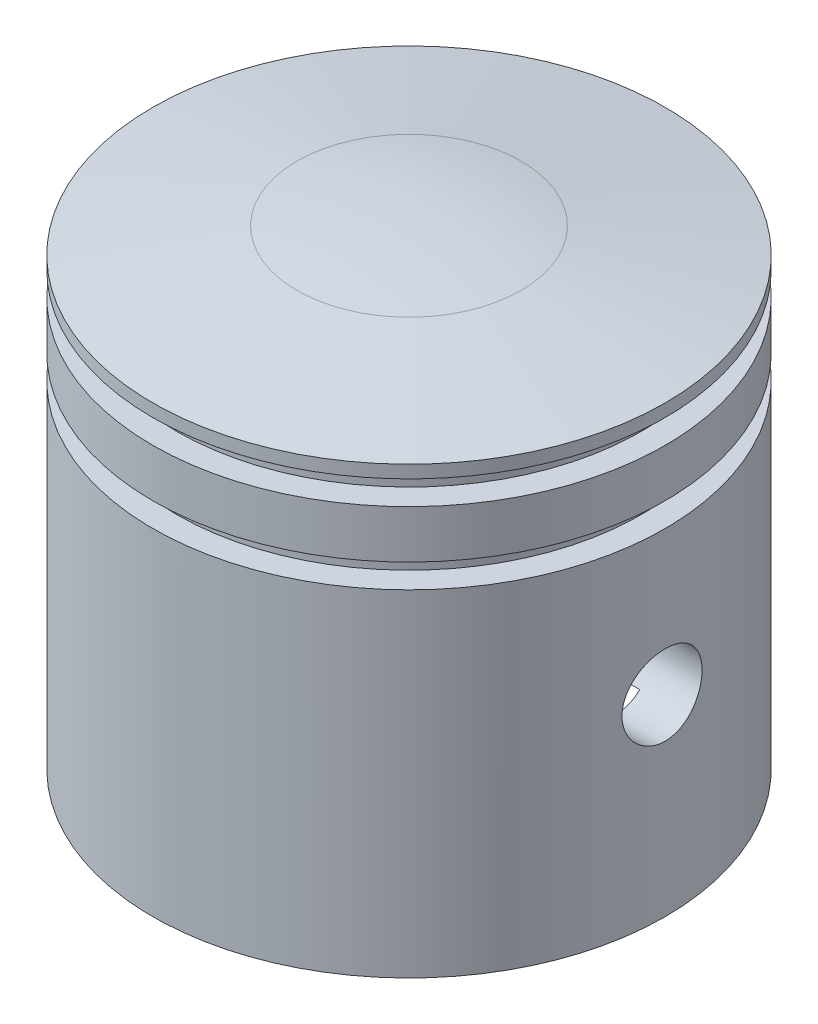
ISO-10303-21;
HEADER;
FILE_DESCRIPTION(('STEP AP214'),'2;1');
FILE_NAME('part.step','',(''),(''),'','','');
FILE_SCHEMA(('AUTOMOTIVE_DESIGN { 1 0 10303 214 1 1 1 1 }'));
ENDSEC;
DATA;
#1=APPLICATION_CONTEXT('core data for automotive mechanical design processes');
#2=APPLICATION_PROTOCOL_DEFINITION('international standard','automotive_design',2000,#1);
#3=PRODUCT_CONTEXT('',#1,'mechanical');
#4=PRODUCT('Part','Part','',(#3));
#5=PRODUCT_RELATED_PRODUCT_CATEGORY('part','',(#4));
#6=PRODUCT_DEFINITION_FORMATION('','',#4);
#7=PRODUCT_DEFINITION_CONTEXT('part definition',#1,'design');
#8=PRODUCT_DEFINITION('design','',#6,#7);
#9=PRODUCT_DEFINITION_SHAPE('','',#8);
#10=(LENGTH_UNIT() NAMED_UNIT(*) SI_UNIT(.MILLI.,.METRE.));
#11=(NAMED_UNIT(*) PLANE_ANGLE_UNIT() SI_UNIT($,.RADIAN.));
#12=(NAMED_UNIT(*) SI_UNIT($,.STERADIAN.) SOLID_ANGLE_UNIT());
#13=UNCERTAINTY_MEASURE_WITH_UNIT(LENGTH_MEASURE(1.E-05),#10,'distance_accuracy_value','');
#14=(GEOMETRIC_REPRESENTATION_CONTEXT(3) GLOBAL_UNCERTAINTY_ASSIGNED_CONTEXT((#13)) GLOBAL_UNIT_ASSIGNED_CONTEXT((#10,
#11,#12)) REPRESENTATION_CONTEXT('',''));
#15=CARTESIAN_POINT('',(0.,0.,0.));
#16=DIRECTION('',(0.,0.,1.));
#17=DIRECTION('',(1.,0.,0.));
#18=AXIS2_PLACEMENT_3D('',#15,#16,#17);
#19=CARTESIAN_POINT('',(0.,10.,0.));
#20=DIRECTION('',(0.,-1.,0.));
#21=DIRECTION('',(1.,0.,0.));
#22=AXIS2_PLACEMENT_3D('',#19,#20,#21);
#23=PLANE('',#22);
#24=DIRECTION('',(1.,0.,0.));
#25=VECTOR('',#24,1.);
#26=CARTESIAN_POINT('',(-16.,10.,-1.5));
#27=LINE('',#26,#25);
#28=CARTESIAN_POINT('',(-12.913171570145,10.,-1.5));
#29=VERTEX_POINT('',#28);
#30=CARTESIAN_POINT('',(-9.88685996664259,10.,-1.5));
#31=VERTEX_POINT('',#30);
#32=EDGE_CURVE('E65',#29,#31,#27,.T.);
#33=ORIENTED_EDGE('',*,*,#32,.F.);
#34=CARTESIAN_POINT('',(0.,10.,0.));
#35=DIRECTION('',(0.,-1.,0.));
#36=DIRECTION('',(1.,0.,0.));
#37=AXIS2_PLACEMENT_3D('',#34,#35,#36);
#38=CIRCLE('',#37,13.);
#39=CARTESIAN_POINT('',(12.913171570145,10.,-1.5));
#40=VERTEX_POINT('',#39);
#41=EDGE_CURVE('E102',#29,#40,#38,.T.);
#42=ORIENTED_EDGE('',*,*,#41,.T.);
#43=CARTESIAN_POINT('',(9.88685996664259,10.,-1.5));
#44=VERTEX_POINT('',#43);
#45=EDGE_CURVE('E248',#44,#40,#27,.T.);
#46=ORIENTED_EDGE('',*,*,#45,.F.);
#47=CARTESIAN_POINT('',(0.,10.,0.));
#48=DIRECTION('',(0.,-1.,0.));
#49=DIRECTION('',(1.,0.,0.));
#50=AXIS2_PLACEMENT_3D('',#47,#48,#49);
#51=CIRCLE('',#50,10.);
#52=EDGE_CURVE('E99',#44,#31,#51,.F.);
#53=ORIENTED_EDGE('',*,*,#52,.T.);
#54=EDGE_LOOP('',(#33,#42,#46,#53));
#55=FACE_BOUND('',#54,.T.);
#56=ADVANCED_FACE('F37',(#55),#23,.T.);
#57=CARTESIAN_POINT('',(0.,-10.,0.));
#58=DIRECTION('',(0.,1.,0.));
#59=DIRECTION('',(1.,0.,0.));
#60=AXIS2_PLACEMENT_3D('',#57,#58,#59);
#61=SPHERICAL_SURFACE('',#60,40.);
#62=CARTESIAN_POINT('',(0.,29.3827373350304,0.));
#63=DIRECTION('',(0.,1.,0.));
#64=DIRECTION('',(-1.,0.,0.));
#65=AXIS2_PLACEMENT_3D('',#62,#63,#64);
#66=CIRCLE('',#65,7.);
#67=CARTESIAN_POINT('',(-7.,29.3827373350304,0.));
#68=VERTEX_POINT('',#67);
#69=EDGE_CURVE('E89',#68,#68,#66,.T.);
#70=ORIENTED_EDGE('',*,*,#69,.T.);
#71=EDGE_LOOP('',(#70));
#72=FACE_BOUND('',#71,.T.);
#73=ADVANCED_FACE('F39',(#72),#61,.T.);
#74=CARTESIAN_POINT('',(0.,27.7957945086542,0.));
#75=DIRECTION('',(0.,-1.,0.));
#76=DIRECTION('',(1.,0.,0.));
#77=AXIS2_PLACEMENT_3D('',#74,#75,#76);
#78=CONICAL_SURFACE('',#77,16.,1.39626340159546);
#79=ORIENTED_EDGE('',*,*,#69,.F.);
#80=EDGE_LOOP('',(#79));
#81=FACE_BOUND('',#80,.T.);
#82=CARTESIAN_POINT('',(0.,27.7957945086542,0.));
#83=DIRECTION('',(0.,1.,0.));
#84=DIRECTION('',(-1.,0.,0.));
#85=AXIS2_PLACEMENT_3D('',#82,#83,#84);
#86=CIRCLE('',#85,16.);
#87=CARTESIAN_POINT('',(-16.,27.7957945086542,0.));
#88=VERTEX_POINT('',#87);
#89=EDGE_CURVE('E224',#88,#88,#86,.T.);
#90=ORIENTED_EDGE('',*,*,#89,.T.);
#91=EDGE_LOOP('',(#90));
#92=FACE_BOUND('',#91,.T.);
#93=ADVANCED_FACE('F154',(#81,#92),#78,.T.);
#94=CARTESIAN_POINT('',(0.,30.,0.));
#95=DIRECTION('',(0.,1.,0.));
#96=DIRECTION('',(-1.,0.,0.));
#97=AXIS2_PLACEMENT_3D('',#94,#95,#96);
#98=CYLINDRICAL_SURFACE('',#97,16.);
#99=CARTESIAN_POINT('',(0.,27.,0.));
#100=DIRECTION('',(0.,1.,0.));
#101=DIRECTION('',(0.,0.,1.));
#102=AXIS2_PLACEMENT_3D('',#99,#100,#101);
#103=CIRCLE('',#102,16.);
#104=CARTESIAN_POINT('',(0.,27.,16.));
#105=VERTEX_POINT('',#104);
#106=EDGE_CURVE('E213',#105,#105,#103,.T.);
#107=ORIENTED_EDGE('',*,*,#106,.T.);
#108=EDGE_LOOP('',(#107));
#109=FACE_BOUND('',#108,.T.);
#110=ORIENTED_EDGE('',*,*,#89,.F.);
#111=EDGE_LOOP('',(#110));
#112=FACE_BOUND('',#111,.T.);
#113=ADVANCED_FACE('F149',(#109,#112),#98,.T.);
#114=CARTESIAN_POINT('',(18.0909758481835,25.5,0.));
#115=DIRECTION('',(0.,-1.,0.));
#116=DIRECTION('',(0.,0.,-1.));
#117=AXIS2_PLACEMENT_3D('',#114,#115,#116);
#118=PLANE('',#117);
#119=CARTESIAN_POINT('',(0.,25.5,0.));
#120=DIRECTION('',(0.,-1.,0.));
#121=DIRECTION('',(0.,0.,-1.));
#122=AXIS2_PLACEMENT_3D('',#119,#120,#121);
#123=CIRCLE('',#122,14.5);
#124=CARTESIAN_POINT('',(0.,25.5,-14.5));
#125=VERTEX_POINT('',#124);
#126=EDGE_CURVE('E210',#125,#125,#123,.T.);
#127=ORIENTED_EDGE('',*,*,#126,.T.);
#128=EDGE_LOOP('',(#127));
#129=FACE_BOUND('',#128,.T.);
#130=CARTESIAN_POINT('',(0.,25.5,0.));
#131=DIRECTION('',(0.,-1.,0.));
#132=DIRECTION('',(0.,0.,-1.));
#133=AXIS2_PLACEMENT_3D('',#130,#131,#132);
#134=CIRCLE('',#133,16.);
#135=CARTESIAN_POINT('',(0.,25.5,-16.));
#136=VERTEX_POINT('',#135);
#137=EDGE_CURVE('E105',#136,#136,#134,.T.);
#138=ORIENTED_EDGE('',*,*,#137,.F.);
#139=EDGE_LOOP('',(#138));
#140=FACE_BOUND('',#139,.T.);
#141=ADVANCED_FACE('F153',(#129,#140),#118,.F.);
#142=CARTESIAN_POINT('',(18.0909758481835,27.,0.));
#143=DIRECTION('',(0.,1.,0.));
#144=DIRECTION('',(0.,0.,1.));
#145=AXIS2_PLACEMENT_3D('',#142,#143,#144);
#146=PLANE('',#145);
#147=CARTESIAN_POINT('',(0.,27.,0.));
#148=DIRECTION('',(0.,-1.,0.));
#149=DIRECTION('',(0.,0.,-1.));
#150=AXIS2_PLACEMENT_3D('',#147,#148,#149);
#151=CIRCLE('',#150,14.5);
#152=CARTESIAN_POINT('',(0.,27.,-14.5));
#153=VERTEX_POINT('',#152);
#154=EDGE_CURVE('E216',#153,#153,#151,.T.);
#155=ORIENTED_EDGE('',*,*,#154,.F.);
#156=EDGE_LOOP('',(#155));
#157=FACE_BOUND('',#156,.T.);
#158=ORIENTED_EDGE('',*,*,#106,.F.);
#159=EDGE_LOOP('',(#158));
#160=FACE_BOUND('',#159,.T.);
#161=ADVANCED_FACE('F199',(#157,#160),#146,.F.);
#162=CARTESIAN_POINT('',(0.,0.,0.));
#163=DIRECTION('',(0.,-1.,0.));
#164=DIRECTION('',(0.,0.,-1.));
#165=AXIS2_PLACEMENT_3D('',#162,#163,#164);
#166=CYLINDRICAL_SURFACE('',#165,14.5);
#167=ORIENTED_EDGE('',*,*,#126,.F.);
#168=EDGE_LOOP('',(#167));
#169=FACE_BOUND('',#168,.T.);
#170=ORIENTED_EDGE('',*,*,#154,.T.);
#171=EDGE_LOOP('',(#170));
#172=FACE_BOUND('',#171,.T.);
#173=ADVANCED_FACE('F191',(#169,#172),#166,.T.);
#174=ORIENTED_EDGE('',*,*,#137,.T.);
#175=EDGE_LOOP('',(#174));
#176=FACE_BOUND('',#175,.T.);
#177=CARTESIAN_POINT('',(0.,22.5,0.));
#178=DIRECTION('',(0.,1.,0.));
#179=DIRECTION('',(0.,0.,1.));
#180=AXIS2_PLACEMENT_3D('',#177,#178,#179);
#181=CIRCLE('',#180,16.);
#182=CARTESIAN_POINT('',(0.,22.5,16.));
#183=VERTEX_POINT('',#182);
#184=EDGE_CURVE('E207',#183,#183,#181,.T.);
#185=ORIENTED_EDGE('',*,*,#184,.T.);
#186=EDGE_LOOP('',(#185));
#187=FACE_BOUND('',#186,.T.);
#188=ADVANCED_FACE('F156',(#176,#187),#98,.T.);
#189=CARTESIAN_POINT('',(17.2340348869537,21.,0.));
#190=DIRECTION('',(0.,-1.,0.));
#191=DIRECTION('',(0.,0.,-1.));
#192=AXIS2_PLACEMENT_3D('',#189,#190,#191);
#193=PLANE('',#192);
#194=CARTESIAN_POINT('',(0.,21.,0.));
#195=DIRECTION('',(0.,-1.,0.));
#196=DIRECTION('',(0.,0.,-1.));
#197=AXIS2_PLACEMENT_3D('',#194,#195,#196);
#198=CIRCLE('',#197,14.5);
#199=CARTESIAN_POINT('',(0.,21.,-14.5));
#200=VERTEX_POINT('',#199);
#201=EDGE_CURVE('E230',#200,#200,#198,.T.);
#202=ORIENTED_EDGE('',*,*,#201,.T.);
#203=EDGE_LOOP('',(#202));
#204=FACE_BOUND('',#203,.T.);
#205=CARTESIAN_POINT('',(0.,21.,0.));
#206=DIRECTION('',(0.,-1.,0.));
#207=DIRECTION('',(0.,0.,-1.));
#208=AXIS2_PLACEMENT_3D('',#205,#206,#207);
#209=CIRCLE('',#208,16.);
#210=CARTESIAN_POINT('',(0.,21.,-16.));
#211=VERTEX_POINT('',#210);
#212=EDGE_CURVE('E209',#211,#211,#209,.T.);
#213=ORIENTED_EDGE('',*,*,#212,.F.);
#214=EDGE_LOOP('',(#213));
#215=FACE_BOUND('',#214,.T.);
#216=ADVANCED_FACE('F190',(#204,#215),#193,.F.);
#217=CARTESIAN_POINT('',(17.2340348869537,22.5,0.));
#218=DIRECTION('',(0.,1.,0.));
#219=DIRECTION('',(0.,0.,1.));
#220=AXIS2_PLACEMENT_3D('',#217,#218,#219);
#221=PLANE('',#220);
#222=CARTESIAN_POINT('',(0.,22.5,0.));
#223=DIRECTION('',(0.,-1.,0.));
#224=DIRECTION('',(0.,0.,-1.));
#225=AXIS2_PLACEMENT_3D('',#222,#223,#224);
#226=CIRCLE('',#225,14.5);
#227=CARTESIAN_POINT('',(0.,22.5,-14.5));
#228=VERTEX_POINT('',#227);
#229=EDGE_CURVE('E233',#228,#228,#226,.T.);
#230=ORIENTED_EDGE('',*,*,#229,.F.);
#231=EDGE_LOOP('',(#230));
#232=FACE_BOUND('',#231,.T.);
#233=ORIENTED_EDGE('',*,*,#184,.F.);
#234=EDGE_LOOP('',(#233));
#235=FACE_BOUND('',#234,.T.);
#236=ADVANCED_FACE('F197',(#232,#235),#221,.F.);
#237=CARTESIAN_POINT('',(0.,0.,0.));
#238=DIRECTION('',(0.,-1.,0.));
#239=DIRECTION('',(0.,0.,-1.));
#240=AXIS2_PLACEMENT_3D('',#237,#238,#239);
#241=CYLINDRICAL_SURFACE('',#240,14.5);
#242=ORIENTED_EDGE('',*,*,#201,.F.);
#243=EDGE_LOOP('',(#242));
#244=FACE_BOUND('',#243,.T.);
#245=ORIENTED_EDGE('',*,*,#229,.T.);
#246=EDGE_LOOP('',(#245));
#247=FACE_BOUND('',#246,.T.);
#248=ADVANCED_FACE('F185',(#244,#247),#241,.T.);
#249=CARTESIAN_POINT('',(0.,0.,0.));
#250=DIRECTION('',(0.,1.,0.));
#251=DIRECTION('',(-1.,0.,0.));
#252=AXIS2_PLACEMENT_3D('',#249,#250,#251);
#253=PLANE('',#252);
#254=CARTESIAN_POINT('',(0.,0.,0.));
#255=DIRECTION('',(0.,-1.,0.));
#256=DIRECTION('',(1.,0.,0.));
#257=AXIS2_PLACEMENT_3D('',#254,#255,#256);
#258=CIRCLE('',#257,13.);
#259=CARTESIAN_POINT('',(13.,0.,0.));
#260=VERTEX_POINT('',#259);
#261=EDGE_CURVE('E240',#260,#260,#258,.T.);
#262=ORIENTED_EDGE('',*,*,#261,.F.);
#263=EDGE_LOOP('',(#262));
#264=FACE_BOUND('',#263,.T.);
#265=CARTESIAN_POINT('',(0.,0.,0.));
#266=DIRECTION('',(0.,1.,0.));
#267=DIRECTION('',(-1.,0.,0.));
#268=AXIS2_PLACEMENT_3D('',#265,#266,#267);
#269=CIRCLE('',#268,16.);
#270=CARTESIAN_POINT('',(-16.,0.,0.));
#271=VERTEX_POINT('',#270);
#272=EDGE_CURVE('E222',#271,#271,#269,.T.);
#273=ORIENTED_EDGE('',*,*,#272,.F.);
#274=EDGE_LOOP('',(#273));
#275=FACE_BOUND('',#274,.T.);
#276=ADVANCED_FACE('F158',(#264,#275),#253,.F.);
#277=CARTESIAN_POINT('',(-16.,9.5,0.));
#278=CARTESIAN_POINT('',(-15.9999977019448,9.50000569827152,-0.139515097271033));
#279=CARTESIAN_POINT('',(-15.9981561248574,9.51171811377356,-0.279109404865704));
#280=CARTESIAN_POINT('',(-15.9909869809759,9.55824369127675,-0.554391314978102));
#281=CARTESIAN_POINT('',(-15.9856560884472,9.59307889250351,-0.690075061323317));
#282=CARTESIAN_POINT('',(-15.9721069716578,9.68477966280662,-0.953512538047404));
#283=CARTESIAN_POINT('',(-15.9638909956317,9.7416280813616,-1.0812723522899));
#284=CARTESIAN_POINT('',(-15.9454779403815,9.87569854514161,-1.3254212510446));
#285=CARTESIAN_POINT('',(-15.9352811186255,9.95291794303594,-1.44181181036831));
#286=CARTESIAN_POINT('',(-15.9139426841436,10.126233048354,-1.66091991165162));
#287=CARTESIAN_POINT('',(-15.9027945139234,10.2224669948902,-1.76352747914264));
#288=CARTESIAN_POINT('',(-15.8808607613029,10.4307819482689,-1.95120768822823));
#289=CARTESIAN_POINT('',(-15.8700752005075,10.5428638973002,-2.03627928654192));
#290=CARTESIAN_POINT('',(-15.8500242812744,10.7804382713437,-2.18690544328884));
#291=CARTESIAN_POINT('',(-15.840767397861,10.9059994823618,-2.25235273557992));
#292=CARTESIAN_POINT('',(-15.8249120174236,11.1665014108578,-2.36118681597065));
#293=CARTESIAN_POINT('',(-15.8183133630222,11.3014415725106,-2.40457491010063));
#294=CARTESIAN_POINT('',(-15.8085863451104,11.5757109011438,-2.46771559322167));
#295=CARTESIAN_POINT('',(-15.8054302653236,11.7149955858188,-2.48765705487496));
#296=CARTESIAN_POINT('',(-15.8028617107177,11.9949671888926,-2.50392369757622));
#297=CARTESIAN_POINT('',(-15.8034490028802,12.135654019466,-2.50025034860466));
#298=CARTESIAN_POINT('',(-15.8082755045521,12.4130970318527,-2.4695458080889));
#299=CARTESIAN_POINT('',(-15.8124817218495,12.5498772233531,-2.44272562959693));
#300=CARTESIAN_POINT('',(-15.8240205634547,12.8169720063593,-2.36681937833752));
#301=CARTESIAN_POINT('',(-15.8313532830641,12.9472864006405,-2.31773262684132));
#302=CARTESIAN_POINT('',(-15.8483550685462,13.1983887126772,-2.19846916949384));
#303=CARTESIAN_POINT('',(-15.8580339308724,13.3191337917731,-2.12820372315549));
#304=CARTESIAN_POINT('',(-15.878630461501,13.5471995356855,-1.96864058146637));
#305=CARTESIAN_POINT('',(-15.8895482178821,13.6545192448875,-1.87934153253017));
#306=CARTESIAN_POINT('',(-15.911537862489,13.8539102466333,-1.68309088822333));
#307=CARTESIAN_POINT('',(-15.9226101363559,13.9458031582695,-1.57595800560539));
#308=CARTESIAN_POINT('',(-15.9435512534783,14.1103331456399,-1.34769694737936));
#309=CARTESIAN_POINT('',(-15.9534200906202,14.1829701235568,-1.22656870068132));
#310=CARTESIAN_POINT('',(-15.9708539902704,14.3069380734224,-0.973595927056491));
#311=CARTESIAN_POINT('',(-15.9784174854193,14.358254558533,-0.841744186240459));
#312=CARTESIAN_POINT('',(-15.9903756000068,14.4379659674472,-0.571149534696758));
#313=CARTESIAN_POINT('',(-15.9947704520898,14.4663625740665,-0.4324071306872));
#314=CARTESIAN_POINT('',(-15.9998651172728,14.4991892764502,-0.153508336763735));
#315=CARTESIAN_POINT('',(-16.0006027179286,14.5038644789762,-0.0133814615087019));
#316=CARTESIAN_POINT('',(-15.9984028649127,14.489767294664,0.265654546411642));
#317=CARTESIAN_POINT('',(-15.9954655349964,14.4709956974109,0.404563719925156));
#318=CARTESIAN_POINT('',(-15.9862692369322,14.4107416123198,0.676473446265705));
#319=CARTESIAN_POINT('',(-15.9800278421539,14.3693792417323,0.809501262056041));
#320=CARTESIAN_POINT('',(-15.9649207568356,14.2652449056012,1.06673406785663));
#321=CARTESIAN_POINT('',(-15.9560549341007,14.2024718615573,1.19093861303941));
#322=CARTESIAN_POINT('',(-15.9365897274094,14.0567280088734,1.42807220225041));
#323=CARTESIAN_POINT('',(-15.9259772866342,13.9736025799095,1.54090512378372));
#324=CARTESIAN_POINT('',(-15.9042388046444,13.7897279140922,1.75110696507806));
#325=CARTESIAN_POINT('',(-15.8931127309268,13.6889775607952,1.84847490447018));
#326=CARTESIAN_POINT('',(-15.8714802753665,13.4716188027828,2.02588080776691));
#327=CARTESIAN_POINT('',(-15.860980411908,13.3548751528777,2.10575398584126));
#328=CARTESIAN_POINT('',(-15.8419069280583,13.1094839263387,2.2447556772664));
#329=CARTESIAN_POINT('',(-15.83333325222,12.9808366925105,2.30388478778105));
#330=CARTESIAN_POINT('',(-15.8191307135236,12.7157703592858,2.39946771944995));
#331=CARTESIAN_POINT('',(-15.8134908234896,12.5793825312344,2.43600654947912));
#332=CARTESIAN_POINT('',(-15.8057657028079,12.302310856336,2.48564122040535));
#333=CARTESIAN_POINT('',(-15.8036802038444,12.161627334581,2.49873883084997));
#334=CARTESIAN_POINT('',(-15.8033105804488,11.8816012840925,2.50107452690756));
#335=CARTESIAN_POINT('',(-15.804985160429,11.7422609030665,2.49057180548425));
#336=CARTESIAN_POINT('',(-15.8118569894183,11.4673547028557,2.44656223255901));
#337=CARTESIAN_POINT('',(-15.8170542307995,11.3317888754983,2.41305543086961));
#338=CARTESIAN_POINT('',(-15.830370888549,11.0683621733595,2.32408329891852));
#339=CARTESIAN_POINT('',(-15.8384876895341,10.9404945217416,2.26863761738581));
#340=CARTESIAN_POINT('',(-15.856731840474,10.6958343863237,2.13738768546417));
#341=CARTESIAN_POINT('',(-15.8668592701083,10.5790423417116,2.06158262820886));
#342=CARTESIAN_POINT('',(-15.8881156809226,10.3585344558732,1.8908300813908));
#343=CARTESIAN_POINT('',(-15.8992540116029,10.2549678033862,1.79569107094768));
#344=CARTESIAN_POINT('',(-15.9212004364073,10.0651787636133,1.58937594638204));
#345=CARTESIAN_POINT('',(-15.9320084534012,9.97896040140812,1.47819612078432));
#346=CARTESIAN_POINT('',(-15.952151024567,9.82584877696844,1.24216685884341));
#347=CARTESIAN_POINT('',(-15.9614763443027,9.75907462724039,1.11723937214238));
#348=CARTESIAN_POINT('',(-15.9775125983888,9.64755900380705,0.857851882357784));
#349=CARTESIAN_POINT('',(-15.9842262014212,9.60279502744161,0.723401776581762));
#350=CARTESIAN_POINT('',(-15.9927744586488,9.54656697890941,0.490314239911593));
#351=CARTESIAN_POINT('',(-15.9954699162612,9.529131509371,0.393105575651624));
#352=CARTESIAN_POINT('',(-15.9990834869762,9.50584608662092,0.197277797850582));
#353=CARTESIAN_POINT('',(-16.0000016250796,9.49999597044266,0.0986587041691184));
#354=CARTESIAN_POINT('',(-16.,9.5,0.));
#355=B_SPLINE_CURVE_WITH_KNOTS('',3,(#277,#278,#279,#280,#281,#282,#283,#284,#285,#286,#287,
#288,#289,#290,#291,#292,#293,#294,#295,#296,#297,#298,#299,#300,#301,#302,#303,#304,#305,#306,
#307,#308,#309,#310,#311,#312,#313,#314,#315,#316,#317,#318,#319,#320,#321,#322,#323,#324,#325,
#326,#327,#328,#329,#330,#331,#332,#333,#334,#335,#336,#337,#338,#339,#340,#341,#342,#343,#344,
#345,#346,#347,#348,#349,#350,#351,#352,#353,#354),.UNSPECIFIED.,.T.,.F.,(4,2,2,2,2,2,2,2,2,2,2,
2,2,2,2,2,2,2,2,2,2,2,2,2,2,2,2,2,2,2,2,2,2,2,2,2,2,2,4),(0.,0.418184740477491,
0.836768642528014,1.25502707944103,1.6732311879203,2.09459568152199,2.51598523645422,
2.93963778605759,3.36326525009238,3.78345631134994,4.20362121670545,4.6199957602258,
5.0363829965105,5.45453977402347,5.87272629892069,6.29545732334367,6.71819049513827,
7.14121043754565,7.56419931829866,7.98280854005914,8.40140366528356,8.81779444756567,
9.23420620742031,9.65388541469671,10.0735912160142,10.4970948024959,10.9205861964898,
11.3424741039513,11.764330162293,12.1815758159869,12.598820566189,13.0156924696662,
13.4325808967135,13.8538201231554,14.275156971423,14.6990230419984,15.1224548565628,
15.4181801635154,15.7139013105871),.UNSPECIFIED.);
#356=CARTESIAN_POINT('',(-16.,9.5,0.));
#357=VERTEX_POINT('',#356);
#358=EDGE_CURVE('E145',#357,#357,#355,.T.);
#359=ORIENTED_EDGE('',*,*,#358,.T.);
#360=EDGE_LOOP('',(#359));
#361=FACE_BOUND('',#360,.T.);
#362=CARTESIAN_POINT('',(15.8034806292791,12.,-2.5));
#363=CARTESIAN_POINT('',(15.8034830346332,11.860496621659,-2.49999429179104));
#364=CARTESIAN_POINT('',(15.8053478026579,11.7209140023147,-2.48828377742084));
#365=CARTESIAN_POINT('',(15.8125997089632,11.4456563709971,-2.44176643645043));
#366=CARTESIAN_POINT('',(15.8179902148259,11.3099852245206,-2.40693752801736));
#367=CARTESIAN_POINT('',(15.8316684916183,11.0465744103556,-2.31525516047132));
#368=CARTESIAN_POINT('',(15.8399539668268,10.9188285521292,-2.25841914921922));
#369=CARTESIAN_POINT('',(15.8584858981599,10.6747031091579,-2.12437791816389));
#370=CARTESIAN_POINT('',(15.8687321022282,10.5583220663405,-2.04717531605122));
#371=CARTESIAN_POINT('',(15.8901303851737,10.3392035148487,-1.87387730110911));
#372=CARTESIAN_POINT('',(15.9012888784461,10.2365789256004,-1.777639886175));
#373=CARTESIAN_POINT('',(15.9231973082665,10.0488657795701,-1.56931080987672));
#374=CARTESIAN_POINT('',(15.9339472216983,9.96377821377571,-1.45721825316848));
#375=CARTESIAN_POINT('',(15.9538946715316,9.81313512295885,-1.21963429185761));
#376=CARTESIAN_POINT('',(15.9630838016344,9.74768399602554,-1.09407592635729));
#377=CARTESIAN_POINT('',(15.978803149105,9.63884204527492,-0.833580171794756));
#378=CARTESIAN_POINT('',(15.9853335186778,9.59544995861733,-0.698643320136811));
#379=CARTESIAN_POINT('',(15.9949542857973,9.53230128104384,-0.424385325448812));
#380=CARTESIAN_POINT('',(15.9980722260505,9.51235535093165,-0.285108760160752));
#381=CARTESIAN_POINT('',(16.0006113098095,9.49607695669663,-0.00515314355067117));
#382=CARTESIAN_POINT('',(16.0000326754547,9.49974307364815,0.135525822989186));
#383=CARTESIAN_POINT('',(15.9952657389868,9.53043592627786,0.413000089722151));
#384=CARTESIAN_POINT('',(15.9911089169598,9.55725893884032,0.549818542575174));
#385=CARTESIAN_POINT('',(15.9796877395528,9.63318402862262,0.816988375343491));
#386=CARTESIAN_POINT('',(15.9724232987387,9.68228671835413,0.947339577352174));
#387=CARTESIAN_POINT('',(15.9555491842028,9.80158365586005,1.19848742679247));
#388=CARTESIAN_POINT('',(15.9459300777042,9.87186300542795,1.31924299071837));
#389=CARTESIAN_POINT('',(15.9254174702046,10.0314560806292,1.54732385653213));
#390=CARTESIAN_POINT('',(15.9145238783282,10.120771163955,1.65464819959324));
#391=CARTESIAN_POINT('',(15.8925387825556,10.3170334870733,1.85402198520023));
#392=CARTESIAN_POINT('',(15.8814464071021,10.4241586663949,1.94589625613075));
#393=CARTESIAN_POINT('',(15.8604269384475,10.6523975646821,2.11039226047485));
#394=CARTESIAN_POINT('',(15.8504998536298,10.7735113842741,2.18301385538335));
#395=CARTESIAN_POINT('',(15.8329349281613,11.0264796281058,2.30697060635685));
#396=CARTESIAN_POINT('',(15.8252991458489,11.1583435750735,2.35828663884161));
#397=CARTESIAN_POINT('',(15.8132168990948,11.4289648487055,2.43799343127668));
#398=CARTESIAN_POINT('',(15.8087701897074,11.5677216450697,2.46638595195258));
#399=CARTESIAN_POINT('',(15.8036163696886,11.8466281032752,2.49919719237856));
#400=CARTESIAN_POINT('',(15.80287044806,11.9867478001948,2.50386473411271));
#401=CARTESIAN_POINT('',(15.8050994977182,12.2657676352979,2.48975479033184));
#402=CARTESIAN_POINT('',(15.8080743433524,12.4046678145059,2.47097809654328));
#403=CARTESIAN_POINT('',(15.8173740105186,12.6765278074665,2.41072412555896));
#404=CARTESIAN_POINT('',(15.8236803883335,12.8095159986396,2.36937178781979));
#405=CARTESIAN_POINT('',(15.8389172439685,13.0666739711039,2.26527072241932));
#406=CARTESIAN_POINT('',(15.8478478614411,13.190843282649,2.20252085602949));
#407=CARTESIAN_POINT('',(15.8674179220711,13.4279512816488,2.05681199170293));
#408=CARTESIAN_POINT('',(15.8780706945976,13.5407902289,1.97369251093471));
#409=CARTESIAN_POINT('',(15.8998450469621,13.7510069808482,1.78982593995283));
#410=CARTESIAN_POINT('',(15.9109666556111,13.848383833607,1.6890777652142));
#411=CARTESIAN_POINT('',(15.9325473887455,14.0258112706355,1.47171546765808));
#412=CARTESIAN_POINT('',(15.9429995842164,14.1056965764301,1.35496564158984));
#413=CARTESIAN_POINT('',(15.9619548934084,14.2447195199902,1.10955861029337));
#414=CARTESIAN_POINT('',(15.9704580640831,14.3038577640459,0.980901753162492));
#415=CARTESIAN_POINT('',(15.9845269767683,14.3994462752842,0.715839663778327));
#416=CARTESIAN_POINT('',(15.9901042225572,14.4359854974394,0.579467147617089));
#417=CARTESIAN_POINT('',(15.9977412978946,14.4856261326728,0.302427949770746));
#418=CARTESIAN_POINT('',(15.9998013804089,14.498729231356,0.161761577654431));
#419=CARTESIAN_POINT('',(16.0001691012796,14.5010818526552,-0.118272165188271));
#420=CARTESIAN_POINT('',(15.9985164403994,14.4905837446428,-0.257637428859786));
#421=CARTESIAN_POINT('',(15.9917247801431,14.4465746838196,-0.532594595464882));
#422=CARTESIAN_POINT('',(15.9865857947973,14.4130638236216,-0.668186513581641));
#423=CARTESIAN_POINT('',(15.9733964142131,14.3240727402876,-0.931668850429401));
#424=CARTESIAN_POINT('',(15.965348528289,14.2686114484191,-1.05956579651625));
#425=CARTESIAN_POINT('',(15.947223323121,14.137321161478,-1.30427807253219));
#426=CARTESIAN_POINT('',(15.9371459268214,14.0614913930258,-1.42109298145458));
#427=CARTESIAN_POINT('',(15.9159528222148,13.8907105567916,-1.64160219185804));
#428=CARTESIAN_POINT('',(15.9048276353277,13.795573685696,-1.745151694824));
#429=CARTESIAN_POINT('',(15.8828612878644,13.5892700426646,-1.93490712736947));
#430=CARTESIAN_POINT('',(15.8720201944801,13.4780995182753,-2.02110898563013));
#431=CARTESIAN_POINT('',(15.8517779742959,13.2420788957246,-2.17420151541622));
#432=CARTESIAN_POINT('',(15.842386091806,13.1171490413903,-2.24097044145097));
#433=CARTESIAN_POINT('',(15.8262143333515,12.85775678237,-2.35247565604314));
#434=CARTESIAN_POINT('',(15.8194317848938,12.7233042988834,-2.3972345005847));
#435=CARTESIAN_POINT('',(15.8107909670081,12.4902302603036,-2.45344906957713));
#436=CARTESIAN_POINT('',(15.8080643798014,12.3930384000151,-2.47087849275467));
#437=CARTESIAN_POINT('',(15.804408373768,12.1972442189536,-2.49415589078729));
#438=CARTESIAN_POINT('',(15.8034789284691,12.0986419189782,-2.50000403623692));
#439=CARTESIAN_POINT('',(15.8034806292791,12.,-2.5));
#440=B_SPLINE_CURVE_WITH_KNOTS('',3,(#362,#363,#364,#365,#366,#367,#368,#369,#370,#371,#372,
#373,#374,#375,#376,#377,#378,#379,#380,#381,#382,#383,#384,#385,#386,#387,#388,#389,#390,#391,
#392,#393,#394,#395,#396,#397,#398,#399,#400,#401,#402,#403,#404,#405,#406,#407,#408,#409,#410,
#411,#412,#413,#414,#415,#416,#417,#418,#419,#420,#421,#422,#423,#424,#425,#426,#427,#428,#429,
#430,#431,#432,#433,#434,#435,#436,#437,#438,#439),.UNSPECIFIED.,.T.,.F.,(4,2,2,2,2,2,2,2,2,2,2,
2,2,2,2,2,2,2,2,2,2,2,2,2,2,2,2,2,2,2,2,2,2,2,2,2,2,2,4),(0.,0.418149527902241,
0.836699032574077,1.25491737645053,1.67308199345223,2.09449258051085,2.51592697424482,
2.93956378022295,3.36317633102573,3.78334397517517,4.20348637030326,4.61996979150785,
5.03646466334576,5.45465612930833,5.87287743207563,6.29556043395287,6.71824647655855,
7.14131110038651,7.56434322607052,7.98292940034458,8.40150143908463,8.81778013452042,
9.23408098683358,9.65377352836981,10.0734918986585,10.4970197199928,10.9205351635679,
11.3423727623224,11.7641800198745,12.18149834073,12.5988149821383,13.0157724881518,
13.432745828047,13.8539404040181,14.275233715164,14.6991122166338,15.1225554163993,
15.4182305458031,15.7139013198205),.UNSPECIFIED.);
#441=CARTESIAN_POINT('',(15.8034806292791,12.,-2.5));
#442=VERTEX_POINT('',#441);
#443=EDGE_CURVE('E139',#442,#442,#440,.T.);
#444=ORIENTED_EDGE('',*,*,#443,.T.);
#445=EDGE_LOOP('',(#444));
#446=FACE_BOUND('',#445,.T.);
#447=ORIENTED_EDGE('',*,*,#212,.T.);
#448=EDGE_LOOP('',(#447));
#449=FACE_BOUND('',#448,.T.);
#450=ORIENTED_EDGE('',*,*,#272,.T.);
#451=EDGE_LOOP('',(#450));
#452=FACE_BOUND('',#451,.T.);
#453=ADVANCED_FACE('F157',(#361,#446,#449,#452),#98,.T.);
#454=DIRECTION('',(1.,0.,0.));
#455=VECTOR('',#454,1.);
#456=CARTESIAN_POINT('',(-16.,10.,1.5));
#457=LINE('',#456,#455);
#458=CARTESIAN_POINT('',(12.913171570145,10.,1.5));
#459=VERTEX_POINT('',#458);
#460=CARTESIAN_POINT('',(9.88685996664259,10.,1.5));
#461=VERTEX_POINT('',#460);
#462=EDGE_CURVE('E58',#459,#461,#457,.F.);
#463=ORIENTED_EDGE('',*,*,#462,.F.);
#464=CARTESIAN_POINT('',(-12.913171570145,10.,1.5));
#465=VERTEX_POINT('',#464);
#466=EDGE_CURVE('E96',#459,#465,#38,.T.);
#467=ORIENTED_EDGE('',*,*,#466,.T.);
#468=CARTESIAN_POINT('',(-9.88685996664259,10.,1.5));
#469=VERTEX_POINT('',#468);
#470=EDGE_CURVE('E83',#469,#465,#457,.F.);
#471=ORIENTED_EDGE('',*,*,#470,.F.);
#472=EDGE_CURVE('E94',#469,#461,#51,.F.);
#473=ORIENTED_EDGE('',*,*,#472,.T.);
#474=EDGE_LOOP('',(#463,#467,#471,#473));
#475=FACE_BOUND('',#474,.T.);
#476=ADVANCED_FACE('F93',(#475),#23,.T.);
#477=CARTESIAN_POINT('',(0.,10.,0.));
#478=DIRECTION('',(0.,-1.,0.));
#479=DIRECTION('',(1.,0.,0.));
#480=AXIS2_PLACEMENT_3D('',#477,#478,#479);
#481=CYLINDRICAL_SURFACE('',#480,13.);
#482=ORIENTED_EDGE('',*,*,#41,.F.);
#483=CARTESIAN_POINT('',(-12.913171570145,10.,-1.5));
#484=CARTESIAN_POINT('',(-12.9196464939997,9.95820085358915,-1.44426579878659));
#485=CARTESIAN_POINT('',(-12.9259549192278,9.91874092086907,-1.38679796540747));
#486=CARTESIAN_POINT('',(-12.9380773902685,9.84473133764257,-1.26873073828123));
#487=CARTESIAN_POINT('',(-12.9438914163828,9.81018188274731,-1.20813121991303));
#488=CARTESIAN_POINT('',(-12.9603404608392,9.71430178140072,-1.02224257355282));
#489=CARTESIAN_POINT('',(-12.9699930765876,9.66067330241013,-0.892775127826518));
#490=CARTESIAN_POINT('',(-12.9855839172602,9.57571702553779,-0.626442746105629));
#491=CARTESIAN_POINT('',(-12.9915189085937,9.54440863841842,-0.489571482352222));
#492=CARTESIAN_POINT('',(-12.9990013032835,9.50512260914373,-0.212467802603065));
#493=CARTESIAN_POINT('',(-13.0005515461425,9.49712986799228,-0.0722376211678128));
#494=CARTESIAN_POINT('',(-12.9991042541622,9.50466026890764,0.206029683769605));
#495=CARTESIAN_POINT('',(-12.996155887224,9.51992916830979,0.344074092382287));
#496=CARTESIAN_POINT('',(-12.986125153176,9.57304239783094,0.615650842540818));
#497=CARTESIAN_POINT('',(-12.9790411747057,9.61089552758196,0.749181403888349));
#498=CARTESIAN_POINT('',(-12.9627490398878,9.70119099514041,0.989738928879762));
#499=CARTESIAN_POINT('',(-12.9539797808047,9.75083257474323,1.09785208331175));
#500=CARTESIAN_POINT('',(-12.9395107443663,9.83627154609569,1.25371177293855));
#501=CARTESIAN_POINT('',(-12.9344702910731,9.86656964555138,1.30459866498264));
#502=CARTESIAN_POINT('',(-12.9240502172861,9.9306832908871,1.4040757561164));
#503=CARTESIAN_POINT('',(-12.9186705698196,9.96449911663509,1.45266577202019));
#504=CARTESIAN_POINT('',(-12.913171570145,10.,1.5));
#505=B_SPLINE_CURVE_WITH_KNOTS('',3,(#483,#484,#485,#486,#487,#488,#489,#490,#491,#492,#493,
#494,#495,#496,#497,#498,#499,#500,#501,#502,#503,#504),.UNSPECIFIED.,.F.,.F.,(4,2,2,2,2,2,2,2,
2,2,4),(0.,0.209776062140149,0.419560478466374,0.838801230764255,1.25840613426738,
1.67773924513586,2.09252194041192,2.50746635565219,2.86404950501363,3.04223164009906,
3.22042796209395),.UNSPECIFIED.);
#506=EDGE_CURVE('E126',#29,#465,#505,.T.);
#507=ORIENTED_EDGE('',*,*,#506,.T.);
#508=ORIENTED_EDGE('',*,*,#466,.F.);
#509=CARTESIAN_POINT('',(12.913171570145,10.,1.5));
#510=CARTESIAN_POINT('',(12.9196464939997,9.95820085358915,1.44426579878659));
#511=CARTESIAN_POINT('',(12.9259549192278,9.91874092086907,1.38679796540747));
#512=CARTESIAN_POINT('',(12.9380773902685,9.84473133764257,1.26873073828123));
#513=CARTESIAN_POINT('',(12.9438914163828,9.81018188274731,1.20813121991303));
#514=CARTESIAN_POINT('',(12.9603404608392,9.71430178140072,1.02224257355282));
#515=CARTESIAN_POINT('',(12.9699930765876,9.66067330241013,0.892775127826518));
#516=CARTESIAN_POINT('',(12.9855839172602,9.57571702553779,0.626442746105629));
#517=CARTESIAN_POINT('',(12.9915189085937,9.54440863841842,0.489571482352222));
#518=CARTESIAN_POINT('',(12.9990013032835,9.50512260914373,0.212467802603065));
#519=CARTESIAN_POINT('',(13.0005515461425,9.49712986799228,0.0722376211678128));
#520=CARTESIAN_POINT('',(12.9991042541622,9.50466026890764,-0.206029683769605));
#521=CARTESIAN_POINT('',(12.996155887224,9.51992916830979,-0.344074092382287));
#522=CARTESIAN_POINT('',(12.986125153176,9.57304239783094,-0.615650842540818));
#523=CARTESIAN_POINT('',(12.9790411747057,9.61089552758196,-0.749181403888349));
#524=CARTESIAN_POINT('',(12.9627490398878,9.70119099514041,-0.989738928879762));
#525=CARTESIAN_POINT('',(12.9539797808047,9.75083257474323,-1.09785208331175));
#526=CARTESIAN_POINT('',(12.9395107443663,9.83627154609569,-1.25371177293855));
#527=CARTESIAN_POINT('',(12.9344702910731,9.86656964555138,-1.30459866498264));
#528=CARTESIAN_POINT('',(12.9240502172861,9.9306832908871,-1.4040757561164));
#529=CARTESIAN_POINT('',(12.9186705698196,9.96449911663509,-1.45266577202019));
#530=CARTESIAN_POINT('',(12.913171570145,10.,-1.5));
#531=B_SPLINE_CURVE_WITH_KNOTS('',3,(#509,#510,#511,#512,#513,#514,#515,#516,#517,#518,#519,
#520,#521,#522,#523,#524,#525,#526,#527,#528,#529,#530),.UNSPECIFIED.,.F.,.F.,(4,2,2,2,2,2,2,2,
2,2,4),(0.,0.209776062140149,0.419560478466374,0.838801230764255,1.25840613426738,
1.67773924513586,2.09252194041192,2.50746635565219,2.86404950501363,3.04223164009906,
3.22042796209395),.UNSPECIFIED.);
#532=EDGE_CURVE('E133',#459,#40,#531,.T.);
#533=ORIENTED_EDGE('',*,*,#532,.T.);
#534=EDGE_LOOP('',(#482,#507,#508,#533));
#535=FACE_BOUND('',#534,.T.);
#536=ORIENTED_EDGE('',*,*,#261,.T.);
#537=EDGE_LOOP('',(#536));
#538=FACE_BOUND('',#537,.T.);
#539=ADVANCED_FACE('F174',(#535,#538),#481,.F.);
#540=CARTESIAN_POINT('',(0.,24.,0.));
#541=DIRECTION('',(0.,-1.,0.));
#542=DIRECTION('',(1.,0.,0.));
#543=AXIS2_PLACEMENT_3D('',#540,#541,#542);
#544=PLANE('',#543);
#545=CARTESIAN_POINT('',(0.,24.,0.));
#546=DIRECTION('',(0.,-1.,0.));
#547=DIRECTION('',(1.,0.,0.));
#548=AXIS2_PLACEMENT_3D('',#545,#546,#547);
#549=CIRCLE('',#548,10.);
#550=CARTESIAN_POINT('',(10.,24.,0.));
#551=VERTEX_POINT('',#550);
#552=EDGE_CURVE('E101',#551,#551,#549,.T.);
#553=ORIENTED_EDGE('',*,*,#552,.T.);
#554=EDGE_LOOP('',(#553));
#555=FACE_BOUND('',#554,.T.);
#556=ADVANCED_FACE('F179',(#555),#544,.T.);
#557=CARTESIAN_POINT('',(0.,24.,0.));
#558=DIRECTION('',(0.,-1.,0.));
#559=DIRECTION('',(1.,0.,0.));
#560=AXIS2_PLACEMENT_3D('',#557,#558,#559);
#561=CYLINDRICAL_SURFACE('',#560,10.);
#562=ORIENTED_EDGE('',*,*,#552,.F.);
#563=EDGE_LOOP('',(#562));
#564=FACE_BOUND('',#563,.T.);
#565=ORIENTED_EDGE('',*,*,#52,.F.);
#566=CARTESIAN_POINT('',(9.88685996664259,10.,-1.5));
#567=CARTESIAN_POINT('',(9.87829702632978,10.0423381044855,-1.55644775774642));
#568=CARTESIAN_POINT('',(9.8695164098382,10.0870272455987,-1.61105469283506));
#569=CARTESIAN_POINT('',(9.85176215376838,10.1808382203519,-1.71628235343694));
#570=CARTESIAN_POINT('',(9.84278851814074,10.2299599633339,-1.76690316043694));
#571=CARTESIAN_POINT('',(9.8159502550057,10.3835199248386,-1.91228287155091));
#572=CARTESIAN_POINT('',(9.79815893076327,10.4941971430423,-2.00061796766923));
#573=CARTESIAN_POINT('',(9.76481433608198,10.7291280421412,-2.15751587055995));
#574=CARTESIAN_POINT('',(9.74926267017561,10.8533913453404,-2.22606453693198));
#575=CARTESIAN_POINT('',(9.72224025261606,11.1120506879739,-2.3412731896829));
#576=CARTESIAN_POINT('',(9.7107671007491,11.246440711182,-2.38794605518357));
#577=CARTESIAN_POINT('',(9.6934351616116,11.5194319951237,-2.45735418339059));
#578=CARTESIAN_POINT('',(9.6874935617474,11.6579379985205,-2.48044304897375));
#579=CARTESIAN_POINT('',(9.68165898643259,11.937005984586,-2.50312290551809));
#580=CARTESIAN_POINT('',(9.68176622057743,12.0775680383293,-2.50271308223673));
#581=CARTESIAN_POINT('',(9.68793593914431,12.3529816746888,-2.47871632829885));
#582=CARTESIAN_POINT('',(9.69384866853871,12.4878879868879,-2.45571222118534));
#583=CARTESIAN_POINT('',(9.71071117534564,12.7518469398539,-2.38815579017542));
#584=CARTESIAN_POINT('',(9.72166092471397,12.8808996132071,-2.34360358625042));
#585=CARTESIAN_POINT('',(9.74746560596719,13.1307885670212,-2.23385335557449));
#586=CARTESIAN_POINT('',(9.7623529195144,13.2515457436194,-2.16848317197037));
#587=CARTESIAN_POINT('',(9.79434578612789,13.4805714327983,-2.01906213967447));
#588=CARTESIAN_POINT('',(9.81145177041249,13.5888375098736,-1.93500765725065));
#589=CARTESIAN_POINT('',(9.84655716119831,13.7930738176455,-1.74774822886379));
#590=CARTESIAN_POINT('',(9.86456812118589,13.8886024628581,-1.64406327335133));
#591=CARTESIAN_POINT('',(9.89902179366731,14.0610160403167,-1.42196244073076));
#592=CARTESIAN_POINT('',(9.91546444768792,14.1379002775831,-1.30354601474862));
#593=CARTESIAN_POINT('',(9.94504061645413,14.2711428922548,-1.05449104713443));
#594=CARTESIAN_POINT('',(9.95815689068242,14.3273949788563,-0.923793454785756));
#595=CARTESIAN_POINT('',(9.97947886085677,14.4170037555349,-0.654395587270725));
#596=CARTESIAN_POINT('',(9.9876854730425,14.4503647177176,-0.515696810583527));
#597=CARTESIAN_POINT('',(9.99811008554861,14.492511399187,-0.237953144489441));
#598=CARTESIAN_POINT('',(10.000472783337,14.5018911060145,-0.0990037399750379));
#599=CARTESIAN_POINT('',(9.99936924845989,14.4974769837093,0.178494017362683));
#600=CARTESIAN_POINT('',(9.9959035931882,14.4836854500677,0.317042408550892));
#601=CARTESIAN_POINT('',(9.98363158834437,14.4338166174374,0.587489627768105));
#602=CARTESIAN_POINT('',(9.97491213094045,14.398101730266,0.719459604109862));
#603=CARTESIAN_POINT('',(9.95313476079063,14.3058384175761,0.975517412390959));
#604=CARTESIAN_POINT('',(9.94007644385454,14.2492880510571,1.09960450871051));
#605=CARTESIAN_POINT('',(9.91073923754746,14.1159019692027,1.33865740980875));
#606=CARTESIAN_POINT('',(9.89441061986185,14.0387459906073,1.45343824787646));
#607=CARTESIAN_POINT('',(9.86040263626624,13.8667177176332,1.66863689951077));
#608=CARTESIAN_POINT('',(9.84272302915515,13.7718422552908,1.76905213905724));
#609=CARTESIAN_POINT('',(9.80745084022131,13.5642240624884,1.95528314890227));
#610=CARTESIAN_POINT('',(9.78987165809029,13.4510916023801,2.04066765914235));
#611=CARTESIAN_POINT('',(9.75727211093036,13.2117695504121,2.19125512858105));
#612=CARTESIAN_POINT('',(9.7422516273326,13.0855805640214,2.25645902305417));
#613=CARTESIAN_POINT('',(9.71660606378031,12.8241689441377,2.36445617235024));
#614=CARTESIAN_POINT('',(9.70596195913239,12.6889884439287,2.40734664724386));
#615=CARTESIAN_POINT('',(9.690285382318,12.4130147047863,2.4697005191477));
#616=CARTESIAN_POINT('',(9.68525196910656,12.272222411187,2.48916784481465));
#617=CARTESIAN_POINT('',(9.681485324806,11.993351206597,2.50377586091762));
#618=CARTESIAN_POINT('',(9.68257592473742,11.855309944987,2.49959675920337));
#619=CARTESIAN_POINT('',(9.69051463097382,11.5819844112358,2.46863857730251));
#620=CARTESIAN_POINT('',(9.69736172755085,11.4466996598465,2.44186346060474));
#621=CARTESIAN_POINT('',(9.7159273203141,11.1837046528562,2.36690028143319));
#622=CARTESIAN_POINT('',(9.7276078655847,11.0559440558689,2.31887884039046));
#623=CARTESIAN_POINT('',(9.75452243524015,10.8101859662753,2.20291272179486));
#624=CARTESIAN_POINT('',(9.76975797816177,10.692192675089,2.13495952708639));
#625=CARTESIAN_POINT('',(9.80205872758479,10.4694963184945,1.98134844584284));
#626=CARTESIAN_POINT('',(9.81911397671681,10.3647271454983,1.89578474961086));
#627=CARTESIAN_POINT('',(9.8447745214587,10.2190217365953,1.755753626632));
#628=CARTESIAN_POINT('',(9.85334316782526,10.172350926578,1.70711514965063));
#629=CARTESIAN_POINT('',(9.870294132368,10.0830705460944,1.60621122310691));
#630=CARTESIAN_POINT('',(9.87867644573856,10.0404610802791,1.5539456801438));
#631=CARTESIAN_POINT('',(9.88685996664259,10.,1.5));
#632=B_SPLINE_CURVE_WITH_KNOTS('',3,(#566,#567,#568,#569,#570,#571,#572,#573,#574,#575,#576,
#577,#578,#579,#580,#581,#582,#583,#584,#585,#586,#587,#588,#589,#590,#591,#592,#593,#594,#595,
#596,#597,#598,#599,#600,#601,#602,#603,#604,#605,#606,#607,#608,#609,#610,#611,#612,#613,#614,
#615,#616,#617,#618,#619,#620,#621,#622,#623,#624,#625,#626,#627,#628,#629,#630,#631),
.UNSPECIFIED.,.F.,.F.,(4,2,2,2,2,2,2,2,2,2,2,2,2,2,2,2,2,2,2,2,2,2,2,2,2,2,2,2,2,2,2,2,4),(0.,
0.213103721326465,0.426203085131621,0.852181800832105,1.27846419335663,1.70449530088863,
2.12404062076728,2.5436004781318,2.95261455314387,3.36162635095093,3.77411240988667,
4.18667875961763,4.61107499679723,5.03548705112688,5.46205582242953,5.88854496274304,
6.30436336451695,6.72014057509215,7.12922311238162,7.53834376879667,7.95423603916423,
8.37020273579977,8.7966430274964,9.22306355277567,9.64761025686135,10.072085743757,
10.4844141078325,10.8966701618447,11.3057489306138,11.7150027605523,12.1221220591718,
12.3257851941602,12.5294535756357),.UNSPECIFIED.);
#633=EDGE_CURVE('E11',#44,#461,#632,.T.);
#634=ORIENTED_EDGE('',*,*,#633,.T.);
#635=ORIENTED_EDGE('',*,*,#472,.F.);
#636=CARTESIAN_POINT('',(-9.88685996664259,10.,1.5));
#637=CARTESIAN_POINT('',(-9.87829702632978,10.0423381044855,1.55644775774642));
#638=CARTESIAN_POINT('',(-9.8695164098382,10.0870272455987,1.61105469283506));
#639=CARTESIAN_POINT('',(-9.85176215376839,10.1808382203519,1.71628235343694));
#640=CARTESIAN_POINT('',(-9.84278851814074,10.2299599633339,1.76690316043694));
#641=CARTESIAN_POINT('',(-9.8159502550057,10.3835199248386,1.91228287155091));
#642=CARTESIAN_POINT('',(-9.79815893076328,10.4941971430423,2.00061796766923));
#643=CARTESIAN_POINT('',(-9.76481433608198,10.7291280421412,2.15751587055995));
#644=CARTESIAN_POINT('',(-9.74926267017561,10.8533913453404,2.22606453693198));
#645=CARTESIAN_POINT('',(-9.72224025261607,11.1120506879739,2.3412731896829));
#646=CARTESIAN_POINT('',(-9.7107671007491,11.246440711182,2.38794605518357));
#647=CARTESIAN_POINT('',(-9.6934351616116,11.5194319951237,2.45735418339059));
#648=CARTESIAN_POINT('',(-9.6874935617474,11.6579379985205,2.48044304897375));
#649=CARTESIAN_POINT('',(-9.6816589864326,11.937005984586,2.50312290551809));
#650=CARTESIAN_POINT('',(-9.68176622057743,12.0775680383293,2.50271308223673));
#651=CARTESIAN_POINT('',(-9.68793593914431,12.3529816746888,2.47871632829885));
#652=CARTESIAN_POINT('',(-9.69384866853872,12.4878879868879,2.45571222118535));
#653=CARTESIAN_POINT('',(-9.71071117534564,12.7518469398539,2.38815579017542));
#654=CARTESIAN_POINT('',(-9.72166092471398,12.8808996132071,2.34360358625043));
#655=CARTESIAN_POINT('',(-9.74746560596719,13.1307885670212,2.23385335557449));
#656=CARTESIAN_POINT('',(-9.7623529195144,13.2515457436194,2.16848317197037));
#657=CARTESIAN_POINT('',(-9.79434578612789,13.4805714327983,2.01906213967447));
#658=CARTESIAN_POINT('',(-9.81145177041249,13.5888375098736,1.93500765725065));
#659=CARTESIAN_POINT('',(-9.84655716119832,13.7930738176455,1.74774822886379));
#660=CARTESIAN_POINT('',(-9.86456812118589,13.8886024628581,1.64406327335133));
#661=CARTESIAN_POINT('',(-9.89902179366731,14.0610160403167,1.42196244073076));
#662=CARTESIAN_POINT('',(-9.91546444768792,14.1379002775831,1.30354601474862));
#663=CARTESIAN_POINT('',(-9.94504061645413,14.2711428922548,1.05449104713443));
#664=CARTESIAN_POINT('',(-9.95815689068242,14.3273949788563,0.923793454785756));
#665=CARTESIAN_POINT('',(-9.97947886085677,14.4170037555349,0.654395587270725));
#666=CARTESIAN_POINT('',(-9.98768547304251,14.4503647177176,0.515696810583527));
#667=CARTESIAN_POINT('',(-9.99811008554861,14.492511399187,0.237953144489441));
#668=CARTESIAN_POINT('',(-10.000472783337,14.5018911060145,0.0990037399750382));
#669=CARTESIAN_POINT('',(-9.99936924845989,14.4974769837093,-0.178494017362683));
#670=CARTESIAN_POINT('',(-9.9959035931882,14.4836854500677,-0.317042408550892));
#671=CARTESIAN_POINT('',(-9.98363158834437,14.4338166174374,-0.587489627768106));
#672=CARTESIAN_POINT('',(-9.97491213094045,14.398101730266,-0.719459604109863));
#673=CARTESIAN_POINT('',(-9.95313476079064,14.3058384175761,-0.97551741239096));
#674=CARTESIAN_POINT('',(-9.94007644385455,14.2492880510571,-1.09960450871051));
#675=CARTESIAN_POINT('',(-9.91073923754746,14.1159019692027,-1.33865740980875));
#676=CARTESIAN_POINT('',(-9.89441061986185,14.0387459906073,-1.45343824787646));
#677=CARTESIAN_POINT('',(-9.86040263626624,13.8667177176332,-1.66863689951077));
#678=CARTESIAN_POINT('',(-9.84272302915515,13.7718422552908,-1.76905213905724));
#679=CARTESIAN_POINT('',(-9.80745084022132,13.5642240624884,-1.95528314890227));
#680=CARTESIAN_POINT('',(-9.78987165809029,13.4510916023801,-2.04066765914235));
#681=CARTESIAN_POINT('',(-9.75727211093037,13.2117695504121,-2.19125512858105));
#682=CARTESIAN_POINT('',(-9.7422516273326,13.0855805640214,-2.25645902305417));
#683=CARTESIAN_POINT('',(-9.71660606378032,12.8241689441377,-2.36445617235024));
#684=CARTESIAN_POINT('',(-9.7059619591324,12.6889884439287,-2.40734664724386));
#685=CARTESIAN_POINT('',(-9.690285382318,12.4130147047863,-2.4697005191477));
#686=CARTESIAN_POINT('',(-9.68525196910656,12.272222411187,-2.48916784481465));
#687=CARTESIAN_POINT('',(-9.681485324806,11.993351206597,-2.50377586091762));
#688=CARTESIAN_POINT('',(-9.68257592473742,11.855309944987,-2.49959675920337));
#689=CARTESIAN_POINT('',(-9.69051463097383,11.5819844112358,-2.46863857730251));
#690=CARTESIAN_POINT('',(-9.69736172755085,11.4466996598465,-2.44186346060474));
#691=CARTESIAN_POINT('',(-9.7159273203141,11.1837046528562,-2.36690028143319));
#692=CARTESIAN_POINT('',(-9.72760786558471,11.0559440558689,-2.31887884039046));
#693=CARTESIAN_POINT('',(-9.75452243524015,10.8101859662753,-2.20291272179486));
#694=CARTESIAN_POINT('',(-9.76975797816177,10.692192675089,-2.13495952708639));
#695=CARTESIAN_POINT('',(-9.80205872758479,10.4694963184945,-1.98134844584284));
#696=CARTESIAN_POINT('',(-9.81911397671682,10.3647271454983,-1.89578474961086));
#697=CARTESIAN_POINT('',(-9.8447745214587,10.2190217365953,-1.755753626632));
#698=CARTESIAN_POINT('',(-9.85334316782526,10.172350926578,-1.70711514965062));
#699=CARTESIAN_POINT('',(-9.870294132368,10.0830705460944,-1.6062112231069));
#700=CARTESIAN_POINT('',(-9.87867644573856,10.0404610802791,-1.5539456801438));
#701=CARTESIAN_POINT('',(-9.8868599666426,10.,-1.5));
#702=B_SPLINE_CURVE_WITH_KNOTS('',3,(#636,#637,#638,#639,#640,#641,#642,#643,#644,#645,#646,
#647,#648,#649,#650,#651,#652,#653,#654,#655,#656,#657,#658,#659,#660,#661,#662,#663,#664,#665,
#666,#667,#668,#669,#670,#671,#672,#673,#674,#675,#676,#677,#678,#679,#680,#681,#682,#683,#684,
#685,#686,#687,#688,#689,#690,#691,#692,#693,#694,#695,#696,#697,#698,#699,#700,#701),
.UNSPECIFIED.,.F.,.F.,(4,2,2,2,2,2,2,2,2,2,2,2,2,2,2,2,2,2,2,2,2,2,2,2,2,2,2,2,2,2,2,2,4),(0.,
0.213103721326465,0.426203085131621,0.852181800832105,1.27846419335663,1.70449530088862,
2.12404062076728,2.5436004781318,2.95261455314387,3.36162635095093,3.77411240988667,
4.18667875961763,4.61107499679723,5.03548705112688,5.46205582242953,5.88854496274304,
6.30436336451694,6.72014057509215,7.12922311238162,7.53834376879667,7.95423603916423,
8.37020273579977,8.7966430274964,9.22306355277567,9.64761025686135,10.072085743757,
10.4844141078325,10.8966701618447,11.3057489306138,11.7150027605523,12.1221220591718,
12.3257851941602,12.5294535756357),.UNSPECIFIED.);
#703=EDGE_CURVE('E51',#469,#31,#702,.T.);
#704=ORIENTED_EDGE('',*,*,#703,.T.);
#705=EDGE_LOOP('',(#565,#634,#635,#704));
#706=FACE_BOUND('',#705,.T.);
#707=ADVANCED_FACE('F98',(#564,#706),#561,.F.);
#708=CARTESIAN_POINT('',(-16.,12.,0.));
#709=DIRECTION('',(1.,0.,0.));
#710=DIRECTION('',(0.,0.,-1.));
#711=AXIS2_PLACEMENT_3D('',#708,#709,#710);
#712=CYLINDRICAL_SURFACE('',#711,2.5);
#713=ORIENTED_EDGE('',*,*,#32,.T.);
#714=ORIENTED_EDGE('',*,*,#703,.F.);
#715=ORIENTED_EDGE('',*,*,#470,.T.);
#716=ORIENTED_EDGE('',*,*,#506,.F.);
#717=EDGE_LOOP('',(#713,#714,#715,#716));
#718=FACE_BOUND('',#717,.T.);
#719=ORIENTED_EDGE('',*,*,#358,.F.);
#720=EDGE_LOOP('',(#719));
#721=FACE_BOUND('',#720,.T.);
#722=ADVANCED_FACE('F81',(#718,#721),#712,.F.);
#723=ORIENTED_EDGE('',*,*,#462,.T.);
#724=ORIENTED_EDGE('',*,*,#633,.F.);
#725=ORIENTED_EDGE('',*,*,#45,.T.);
#726=ORIENTED_EDGE('',*,*,#532,.F.);
#727=EDGE_LOOP('',(#723,#724,#725,#726));
#728=FACE_BOUND('',#727,.T.);
#729=ORIENTED_EDGE('',*,*,#443,.F.);
#730=EDGE_LOOP('',(#729));
#731=FACE_BOUND('',#730,.T.);
#732=ADVANCED_FACE('F117',(#728,#731),#712,.F.);
#733=CLOSED_SHELL('',(#56,#73,#93,#113,#141,#161,#173,#188,#216,#236,#248,#276,#453,#476,#539,
#556,#707,#722,#732));
#734=MANIFOLD_SOLID_BREP('B2',#733);
#735=ADVANCED_BREP_SHAPE_REPRESENTATION('',(#18,#734),#14);
#736=SHAPE_DEFINITION_REPRESENTATION(#9,#735);
ENDSEC;
END-ISO-10303-21;
